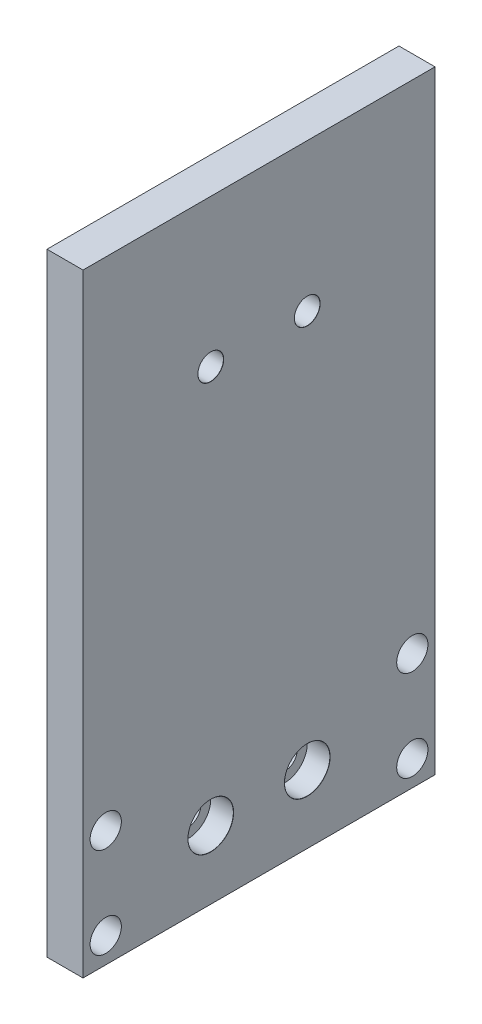
ISO-10303-21;
HEADER;
FILE_DESCRIPTION(('STEP AP214'),'2;1');
FILE_NAME('part.step','',(''),(''),'','','');
FILE_SCHEMA(('AUTOMOTIVE_DESIGN { 1 0 10303 214 1 1 1 1 }'));
ENDSEC;
DATA;
#1=APPLICATION_CONTEXT('core data for automotive mechanical design processes');
#2=APPLICATION_PROTOCOL_DEFINITION('international standard','automotive_design',2000,#1);
#3=PRODUCT_CONTEXT('',#1,'mechanical');
#4=PRODUCT('Part','Part','',(#3));
#5=PRODUCT_RELATED_PRODUCT_CATEGORY('part','',(#4));
#6=PRODUCT_DEFINITION_FORMATION('','',#4);
#7=PRODUCT_DEFINITION_CONTEXT('part definition',#1,'design');
#8=PRODUCT_DEFINITION('design','',#6,#7);
#9=PRODUCT_DEFINITION_SHAPE('','',#8);
#10=(LENGTH_UNIT() NAMED_UNIT(*) SI_UNIT(.MILLI.,.METRE.));
#11=(NAMED_UNIT(*) PLANE_ANGLE_UNIT() SI_UNIT($,.RADIAN.));
#12=(NAMED_UNIT(*) SI_UNIT($,.STERADIAN.) SOLID_ANGLE_UNIT());
#13=UNCERTAINTY_MEASURE_WITH_UNIT(LENGTH_MEASURE(1.E-05),#10,'distance_accuracy_value','');
#14=(GEOMETRIC_REPRESENTATION_CONTEXT(3) GLOBAL_UNCERTAINTY_ASSIGNED_CONTEXT((#13)) GLOBAL_UNIT_ASSIGNED_CONTEXT((#10,
#11,#12)) REPRESENTATION_CONTEXT('',''));
#15=CARTESIAN_POINT('',(0.,0.,0.));
#16=DIRECTION('',(0.,0.,1.));
#17=DIRECTION('',(1.,0.,0.));
#18=AXIS2_PLACEMENT_3D('',#15,#16,#17);
#19=CARTESIAN_POINT('',(6.35,0.,0.));
#20=DIRECTION('',(0.,0.,-1.));
#21=DIRECTION('',(-1.,0.,0.));
#22=AXIS2_PLACEMENT_3D('',#19,#20,#21);
#23=PLANE('',#22);
#24=DIRECTION('',(0.,-1.,0.));
#25=VECTOR('',#24,1.);
#26=CARTESIAN_POINT('',(0.,0.,0.));
#27=LINE('',#26,#25);
#28=CARTESIAN_POINT('',(0.,108.,0.));
#29=VERTEX_POINT('',#28);
#30=CARTESIAN_POINT('',(0.,0.,0.));
#31=VERTEX_POINT('',#30);
#32=EDGE_CURVE('E113',#29,#31,#27,.T.);
#33=ORIENTED_EDGE('',*,*,#32,.T.);
#34=DIRECTION('',(-1.,0.,0.));
#35=VECTOR('',#34,1.);
#36=CARTESIAN_POINT('',(6.35,0.,0.));
#37=LINE('',#36,#35);
#38=CARTESIAN_POINT('',(6.35,0.,0.));
#39=VERTEX_POINT('',#38);
#40=EDGE_CURVE('E11',#39,#31,#37,.T.);
#41=ORIENTED_EDGE('',*,*,#40,.F.);
#42=DIRECTION('',(0.,-1.,0.));
#43=VECTOR('',#42,1.);
#44=CARTESIAN_POINT('',(6.35,0.,0.));
#45=LINE('',#44,#43);
#46=CARTESIAN_POINT('',(6.35,108.,0.));
#47=VERTEX_POINT('',#46);
#48=EDGE_CURVE('E97',#47,#39,#45,.T.);
#49=ORIENTED_EDGE('',*,*,#48,.F.);
#50=DIRECTION('',(-1.,0.,0.));
#51=VECTOR('',#50,1.);
#52=CARTESIAN_POINT('',(6.35,108.,0.));
#53=LINE('',#52,#51);
#54=EDGE_CURVE('E109',#47,#29,#53,.T.);
#55=ORIENTED_EDGE('',*,*,#54,.T.);
#56=EDGE_LOOP('',(#33,#41,#49,#55));
#57=FACE_BOUND('',#56,.T.);
#58=ADVANCED_FACE('F45',(#57),#23,.F.);
#59=CARTESIAN_POINT('',(6.35,0.,0.));
#60=DIRECTION('',(0.,1.,0.));
#61=DIRECTION('',(0.,0.,1.));
#62=AXIS2_PLACEMENT_3D('',#59,#60,#61);
#63=PLANE('',#62);
#64=DIRECTION('',(0.,0.,-1.));
#65=VECTOR('',#64,1.);
#66=CARTESIAN_POINT('',(0.,0.,0.));
#67=LINE('',#66,#65);
#68=CARTESIAN_POINT('',(0.,0.,-62.));
#69=VERTEX_POINT('',#68);
#70=EDGE_CURVE('E102',#31,#69,#67,.T.);
#71=ORIENTED_EDGE('',*,*,#70,.T.);
#72=DIRECTION('',(-1.,0.,0.));
#73=VECTOR('',#72,1.);
#74=CARTESIAN_POINT('',(6.35,0.,-62.));
#75=LINE('',#74,#73);
#76=CARTESIAN_POINT('',(6.35,0.,-62.));
#77=VERTEX_POINT('',#76);
#78=EDGE_CURVE('E54',#77,#69,#75,.T.);
#79=ORIENTED_EDGE('',*,*,#78,.F.);
#80=DIRECTION('',(0.,0.,-1.));
#81=VECTOR('',#80,1.);
#82=CARTESIAN_POINT('',(6.35,0.,0.));
#83=LINE('',#82,#81);
#84=EDGE_CURVE('E92',#39,#77,#83,.T.);
#85=ORIENTED_EDGE('',*,*,#84,.F.);
#86=ORIENTED_EDGE('',*,*,#40,.T.);
#87=EDGE_LOOP('',(#71,#79,#85,#86));
#88=FACE_BOUND('',#87,.T.);
#89=ADVANCED_FACE('F101',(#88),#63,.F.);
#90=CARTESIAN_POINT('',(6.35,0.,-62.));
#91=DIRECTION('',(0.,0.,1.));
#92=DIRECTION('',(1.,0.,0.));
#93=AXIS2_PLACEMENT_3D('',#90,#91,#92);
#94=PLANE('',#93);
#95=DIRECTION('',(0.,1.,0.));
#96=VECTOR('',#95,1.);
#97=CARTESIAN_POINT('',(0.,0.,-62.));
#98=LINE('',#97,#96);
#99=CARTESIAN_POINT('',(0.,108.,-62.));
#100=VERTEX_POINT('',#99);
#101=EDGE_CURVE('E79',#69,#100,#98,.T.);
#102=ORIENTED_EDGE('',*,*,#101,.T.);
#103=DIRECTION('',(-1.,0.,0.));
#104=VECTOR('',#103,1.);
#105=CARTESIAN_POINT('',(6.35,108.,-62.));
#106=LINE('',#105,#104);
#107=CARTESIAN_POINT('',(6.35,108.,-62.));
#108=VERTEX_POINT('',#107);
#109=EDGE_CURVE('E104',#108,#100,#106,.T.);
#110=ORIENTED_EDGE('',*,*,#109,.F.);
#111=DIRECTION('',(0.,1.,0.));
#112=VECTOR('',#111,1.);
#113=CARTESIAN_POINT('',(6.35,0.,-62.));
#114=LINE('',#113,#112);
#115=EDGE_CURVE('E95',#77,#108,#114,.T.);
#116=ORIENTED_EDGE('',*,*,#115,.F.);
#117=ORIENTED_EDGE('',*,*,#78,.T.);
#118=EDGE_LOOP('',(#102,#110,#116,#117));
#119=FACE_BOUND('',#118,.T.);
#120=ADVANCED_FACE('F105',(#119),#94,.F.);
#121=CARTESIAN_POINT('',(6.35,108.,0.));
#122=DIRECTION('',(0.,-1.,0.));
#123=DIRECTION('',(0.,0.,-1.));
#124=AXIS2_PLACEMENT_3D('',#121,#122,#123);
#125=PLANE('',#124);
#126=DIRECTION('',(0.,0.,1.));
#127=VECTOR('',#126,1.);
#128=CARTESIAN_POINT('',(0.,108.,0.));
#129=LINE('',#128,#127);
#130=EDGE_CURVE('E85',#100,#29,#129,.T.);
#131=ORIENTED_EDGE('',*,*,#130,.T.);
#132=ORIENTED_EDGE('',*,*,#54,.F.);
#133=DIRECTION('',(0.,0.,1.));
#134=VECTOR('',#133,1.);
#135=CARTESIAN_POINT('',(6.35,108.,0.));
#136=LINE('',#135,#134);
#137=EDGE_CURVE('E62',#108,#47,#136,.T.);
#138=ORIENTED_EDGE('',*,*,#137,.F.);
#139=ORIENTED_EDGE('',*,*,#109,.T.);
#140=EDGE_LOOP('',(#131,#132,#138,#139));
#141=FACE_BOUND('',#140,.T.);
#142=ADVANCED_FACE('F127',(#141),#125,.F.);
#143=CARTESIAN_POINT('',(6.35,0.,0.));
#144=DIRECTION('',(-1.,0.,0.));
#145=DIRECTION('',(0.,0.,1.));
#146=AXIS2_PLACEMENT_3D('',#143,#144,#145);
#147=PLANE('',#146);
#148=CARTESIAN_POINT('',(6.35,12.,-22.5));
#149=DIRECTION('',(1.,0.,0.));
#150=DIRECTION('',(0.,0.,-1.));
#151=AXIS2_PLACEMENT_3D('',#148,#149,#150);
#152=CIRCLE('',#151,4.025);
#153=CARTESIAN_POINT('',(6.35,12.,-26.525));
#154=VERTEX_POINT('',#153);
#155=EDGE_CURVE('E241',#154,#154,#152,.T.);
#156=ORIENTED_EDGE('',*,*,#155,.F.);
#157=EDGE_LOOP('',(#156));
#158=FACE_BOUND('',#157,.T.);
#159=CARTESIAN_POINT('',(6.35,12.,-39.5));
#160=DIRECTION('',(1.,0.,0.));
#161=DIRECTION('',(0.,0.,-1.));
#162=AXIS2_PLACEMENT_3D('',#159,#160,#161);
#163=CIRCLE('',#162,4.025);
#164=CARTESIAN_POINT('',(6.35,12.,-43.525));
#165=VERTEX_POINT('',#164);
#166=EDGE_CURVE('E221',#165,#165,#163,.T.);
#167=ORIENTED_EDGE('',*,*,#166,.F.);
#168=EDGE_LOOP('',(#167));
#169=FACE_BOUND('',#168,.T.);
#170=CARTESIAN_POINT('',(6.35,82.,-39.5));
#171=DIRECTION('',(1.,0.,0.));
#172=DIRECTION('',(0.,0.,-1.));
#173=AXIS2_PLACEMENT_3D('',#170,#171,#172);
#174=CIRCLE('',#173,2.275);
#175=CARTESIAN_POINT('',(6.35,82.,-41.775));
#176=VERTEX_POINT('',#175);
#177=EDGE_CURVE('E201',#176,#176,#174,.T.);
#178=ORIENTED_EDGE('',*,*,#177,.F.);
#179=EDGE_LOOP('',(#178));
#180=FACE_BOUND('',#179,.T.);
#181=CARTESIAN_POINT('',(6.35,82.,-22.5));
#182=DIRECTION('',(1.,0.,0.));
#183=DIRECTION('',(0.,0.,-1.));
#184=AXIS2_PLACEMENT_3D('',#181,#182,#183);
#185=CIRCLE('',#184,2.275);
#186=CARTESIAN_POINT('',(6.35,82.,-24.775));
#187=VERTEX_POINT('',#186);
#188=EDGE_CURVE('E189',#187,#187,#185,.T.);
#189=ORIENTED_EDGE('',*,*,#188,.F.);
#190=EDGE_LOOP('',(#189));
#191=FACE_BOUND('',#190,.T.);
#192=CARTESIAN_POINT('',(6.35,20.5,-4.00000000000001));
#193=DIRECTION('',(-1.,0.,0.));
#194=DIRECTION('',(0.,0.,1.));
#195=AXIS2_PLACEMENT_3D('',#192,#193,#194);
#196=CIRCLE('',#195,2.75);
#197=CARTESIAN_POINT('',(6.35,20.5,-1.25000000000001));
#198=VERTEX_POINT('',#197);
#199=EDGE_CURVE('E169',#198,#198,#196,.T.);
#200=ORIENTED_EDGE('',*,*,#199,.T.);
#201=EDGE_LOOP('',(#200));
#202=FACE_BOUND('',#201,.T.);
#203=CARTESIAN_POINT('',(6.35,4.49999999999999,-4.));
#204=DIRECTION('',(-1.,0.,0.));
#205=DIRECTION('',(0.,0.,1.));
#206=AXIS2_PLACEMENT_3D('',#203,#204,#205);
#207=CIRCLE('',#206,2.75);
#208=CARTESIAN_POINT('',(6.35,4.49999999999999,-1.25));
#209=VERTEX_POINT('',#208);
#210=EDGE_CURVE('E157',#209,#209,#207,.T.);
#211=ORIENTED_EDGE('',*,*,#210,.T.);
#212=EDGE_LOOP('',(#211));
#213=FACE_BOUND('',#212,.T.);
#214=CARTESIAN_POINT('',(6.35,4.49999999999998,-58.));
#215=DIRECTION('',(-1.,0.,0.));
#216=DIRECTION('',(0.,0.,1.));
#217=AXIS2_PLACEMENT_3D('',#214,#215,#216);
#218=CIRCLE('',#217,2.75);
#219=CARTESIAN_POINT('',(6.35,4.49999999999998,-55.25));
#220=VERTEX_POINT('',#219);
#221=EDGE_CURVE('E145',#220,#220,#218,.T.);
#222=ORIENTED_EDGE('',*,*,#221,.T.);
#223=EDGE_LOOP('',(#222));
#224=FACE_BOUND('',#223,.T.);
#225=CARTESIAN_POINT('',(6.35,20.5,-58.));
#226=DIRECTION('',(-1.,0.,0.));
#227=DIRECTION('',(0.,0.,1.));
#228=AXIS2_PLACEMENT_3D('',#225,#226,#227);
#229=CIRCLE('',#228,2.75);
#230=CARTESIAN_POINT('',(6.35,20.5,-55.25));
#231=VERTEX_POINT('',#230);
#232=EDGE_CURVE('E117',#231,#231,#229,.T.);
#233=ORIENTED_EDGE('',*,*,#232,.T.);
#234=EDGE_LOOP('',(#233));
#235=FACE_BOUND('',#234,.T.);
#236=ORIENTED_EDGE('',*,*,#48,.T.);
#237=ORIENTED_EDGE('',*,*,#84,.T.);
#238=ORIENTED_EDGE('',*,*,#115,.T.);
#239=ORIENTED_EDGE('',*,*,#137,.T.);
#240=EDGE_LOOP('',(#236,#237,#238,#239));
#241=FACE_BOUND('',#240,.T.);
#242=ADVANCED_FACE('F93',(#158,#169,#180,#191,#202,#213,#224,#235,#241),#147,.F.);
#243=CARTESIAN_POINT('',(0.,0.,0.));
#244=DIRECTION('',(-1.,0.,0.));
#245=DIRECTION('',(0.,0.,1.));
#246=AXIS2_PLACEMENT_3D('',#243,#244,#245);
#247=PLANE('',#246);
#248=CARTESIAN_POINT('',(0.,12.,-22.5));
#249=DIRECTION('',(1.,0.,0.));
#250=DIRECTION('',(0.,0.,-1.));
#251=AXIS2_PLACEMENT_3D('',#248,#249,#250);
#252=CIRCLE('',#251,2.25);
#253=CARTESIAN_POINT('',(0.,12.,-24.75));
#254=VERTEX_POINT('',#253);
#255=EDGE_CURVE('E225',#254,#254,#252,.T.);
#256=ORIENTED_EDGE('',*,*,#255,.T.);
#257=EDGE_LOOP('',(#256));
#258=FACE_BOUND('',#257,.T.);
#259=CARTESIAN_POINT('',(0.,12.,-39.5));
#260=DIRECTION('',(1.,0.,0.));
#261=DIRECTION('',(0.,0.,-1.));
#262=AXIS2_PLACEMENT_3D('',#259,#260,#261);
#263=CIRCLE('',#262,2.25);
#264=CARTESIAN_POINT('',(0.,12.,-41.75));
#265=VERTEX_POINT('',#264);
#266=EDGE_CURVE('E205',#265,#265,#263,.T.);
#267=ORIENTED_EDGE('',*,*,#266,.T.);
#268=EDGE_LOOP('',(#267));
#269=FACE_BOUND('',#268,.T.);
#270=CARTESIAN_POINT('',(0.,82.,-39.5));
#271=DIRECTION('',(1.,0.,0.));
#272=DIRECTION('',(0.,0.,-1.));
#273=AXIS2_PLACEMENT_3D('',#270,#271,#272);
#274=CIRCLE('',#273,2.25);
#275=CARTESIAN_POINT('',(0.,82.,-41.75));
#276=VERTEX_POINT('',#275);
#277=EDGE_CURVE('E193',#276,#276,#274,.T.);
#278=ORIENTED_EDGE('',*,*,#277,.T.);
#279=EDGE_LOOP('',(#278));
#280=FACE_BOUND('',#279,.T.);
#281=CARTESIAN_POINT('',(0.,82.,-22.5));
#282=DIRECTION('',(1.,0.,0.));
#283=DIRECTION('',(0.,0.,-1.));
#284=AXIS2_PLACEMENT_3D('',#281,#282,#283);
#285=CIRCLE('',#284,2.25);
#286=CARTESIAN_POINT('',(0.,82.,-24.75));
#287=VERTEX_POINT('',#286);
#288=EDGE_CURVE('E181',#287,#287,#285,.T.);
#289=ORIENTED_EDGE('',*,*,#288,.T.);
#290=EDGE_LOOP('',(#289));
#291=FACE_BOUND('',#290,.T.);
#292=CARTESIAN_POINT('',(0.,20.5,-4.00000000000001));
#293=DIRECTION('',(-1.,0.,0.));
#294=DIRECTION('',(0.,0.,1.));
#295=AXIS2_PLACEMENT_3D('',#292,#293,#294);
#296=CIRCLE('',#295,2.775);
#297=CARTESIAN_POINT('',(0.,20.5,-1.22500000000001));
#298=VERTEX_POINT('',#297);
#299=EDGE_CURVE('E177',#298,#298,#296,.T.);
#300=ORIENTED_EDGE('',*,*,#299,.F.);
#301=EDGE_LOOP('',(#300));
#302=FACE_BOUND('',#301,.T.);
#303=CARTESIAN_POINT('',(0.,4.49999999999999,-4.));
#304=DIRECTION('',(-1.,0.,0.));
#305=DIRECTION('',(0.,0.,1.));
#306=AXIS2_PLACEMENT_3D('',#303,#304,#305);
#307=CIRCLE('',#306,2.775);
#308=CARTESIAN_POINT('',(0.,4.49999999999999,-1.225));
#309=VERTEX_POINT('',#308);
#310=EDGE_CURVE('E165',#309,#309,#307,.T.);
#311=ORIENTED_EDGE('',*,*,#310,.F.);
#312=EDGE_LOOP('',(#311));
#313=FACE_BOUND('',#312,.T.);
#314=CARTESIAN_POINT('',(0.,4.49999999999998,-58.));
#315=DIRECTION('',(-1.,0.,0.));
#316=DIRECTION('',(0.,0.,1.));
#317=AXIS2_PLACEMENT_3D('',#314,#315,#316);
#318=CIRCLE('',#317,2.775);
#319=CARTESIAN_POINT('',(0.,4.49999999999998,-55.225));
#320=VERTEX_POINT('',#319);
#321=EDGE_CURVE('E153',#320,#320,#318,.T.);
#322=ORIENTED_EDGE('',*,*,#321,.F.);
#323=EDGE_LOOP('',(#322));
#324=FACE_BOUND('',#323,.T.);
#325=CARTESIAN_POINT('',(0.,20.5,-58.));
#326=DIRECTION('',(-1.,0.,0.));
#327=DIRECTION('',(0.,0.,1.));
#328=AXIS2_PLACEMENT_3D('',#325,#326,#327);
#329=CIRCLE('',#328,2.775);
#330=CARTESIAN_POINT('',(0.,20.5,-55.225));
#331=VERTEX_POINT('',#330);
#332=EDGE_CURVE('E141',#331,#331,#329,.T.);
#333=ORIENTED_EDGE('',*,*,#332,.F.);
#334=EDGE_LOOP('',(#333));
#335=FACE_BOUND('',#334,.T.);
#336=ORIENTED_EDGE('',*,*,#32,.F.);
#337=ORIENTED_EDGE('',*,*,#130,.F.);
#338=ORIENTED_EDGE('',*,*,#101,.F.);
#339=ORIENTED_EDGE('',*,*,#70,.F.);
#340=EDGE_LOOP('',(#336,#337,#338,#339));
#341=FACE_BOUND('',#340,.T.);
#342=ADVANCED_FACE('F130',(#258,#269,#280,#291,#302,#313,#324,#335,#341),#247,.T.);
#343=CARTESIAN_POINT('',(0.,20.5,-58.));
#344=DIRECTION('',(-1.,0.,0.));
#345=DIRECTION('',(0.,0.,1.));
#346=AXIS2_PLACEMENT_3D('',#343,#344,#345);
#347=CYLINDRICAL_SURFACE('',#346,2.75);
#348=ORIENTED_EDGE('',*,*,#232,.F.);
#349=EDGE_LOOP('',(#348));
#350=FACE_BOUND('',#349,.T.);
#351=CARTESIAN_POINT('',(0.0209774907794329,20.5,-58.));
#352=DIRECTION('',(-1.,0.,0.));
#353=DIRECTION('',(0.,0.,1.));
#354=AXIS2_PLACEMENT_3D('',#351,#352,#353);
#355=CIRCLE('',#354,2.75);
#356=CARTESIAN_POINT('',(0.0209774907794329,20.5,-55.25));
#357=VERTEX_POINT('',#356);
#358=EDGE_CURVE('E137',#357,#357,#355,.T.);
#359=ORIENTED_EDGE('',*,*,#358,.T.);
#360=EDGE_LOOP('',(#359));
#361=FACE_BOUND('',#360,.T.);
#362=ADVANCED_FACE('F265',(#350,#361),#347,.F.);
#363=CARTESIAN_POINT('',(0.,20.5,-58.));
#364=DIRECTION('',(-1.,0.,0.));
#365=DIRECTION('',(0.,0.,1.));
#366=AXIS2_PLACEMENT_3D('',#363,#364,#365);
#367=CONICAL_SURFACE('',#366,2.775,0.872664625997118);
#368=ORIENTED_EDGE('',*,*,#358,.F.);
#369=EDGE_LOOP('',(#368));
#370=FACE_BOUND('',#369,.T.);
#371=ORIENTED_EDGE('',*,*,#332,.T.);
#372=EDGE_LOOP('',(#371));
#373=FACE_BOUND('',#372,.T.);
#374=ADVANCED_FACE('F268',(#370,#373),#367,.F.);
#375=CARTESIAN_POINT('',(0.,4.49999999999998,-58.));
#376=DIRECTION('',(-1.,0.,0.));
#377=DIRECTION('',(0.,0.,1.));
#378=AXIS2_PLACEMENT_3D('',#375,#376,#377);
#379=CYLINDRICAL_SURFACE('',#378,2.75);
#380=ORIENTED_EDGE('',*,*,#221,.F.);
#381=EDGE_LOOP('',(#380));
#382=FACE_BOUND('',#381,.T.);
#383=CARTESIAN_POINT('',(0.0209774907794329,4.49999999999998,-58.));
#384=DIRECTION('',(-1.,0.,0.));
#385=DIRECTION('',(0.,0.,1.));
#386=AXIS2_PLACEMENT_3D('',#383,#384,#385);
#387=CIRCLE('',#386,2.75);
#388=CARTESIAN_POINT('',(0.0209774907794329,4.49999999999998,-55.25));
#389=VERTEX_POINT('',#388);
#390=EDGE_CURVE('E149',#389,#389,#387,.T.);
#391=ORIENTED_EDGE('',*,*,#390,.T.);
#392=EDGE_LOOP('',(#391));
#393=FACE_BOUND('',#392,.T.);
#394=ADVANCED_FACE('F274',(#382,#393),#379,.F.);
#395=CARTESIAN_POINT('',(0.,4.49999999999998,-58.));
#396=DIRECTION('',(-1.,0.,0.));
#397=DIRECTION('',(0.,0.,1.));
#398=AXIS2_PLACEMENT_3D('',#395,#396,#397);
#399=CONICAL_SURFACE('',#398,2.775,0.872664625997135);
#400=ORIENTED_EDGE('',*,*,#390,.F.);
#401=EDGE_LOOP('',(#400));
#402=FACE_BOUND('',#401,.T.);
#403=ORIENTED_EDGE('',*,*,#321,.T.);
#404=EDGE_LOOP('',(#403));
#405=FACE_BOUND('',#404,.T.);
#406=ADVANCED_FACE('F486',(#402,#405),#399,.F.);
#407=CARTESIAN_POINT('',(0.,4.49999999999999,-4.));
#408=DIRECTION('',(-1.,0.,0.));
#409=DIRECTION('',(0.,0.,1.));
#410=AXIS2_PLACEMENT_3D('',#407,#408,#409);
#411=CYLINDRICAL_SURFACE('',#410,2.75);
#412=ORIENTED_EDGE('',*,*,#210,.F.);
#413=EDGE_LOOP('',(#412));
#414=FACE_BOUND('',#413,.T.);
#415=CARTESIAN_POINT('',(0.0209774907794329,4.49999999999999,-4.));
#416=DIRECTION('',(-1.,0.,0.));
#417=DIRECTION('',(0.,0.,1.));
#418=AXIS2_PLACEMENT_3D('',#415,#416,#417);
#419=CIRCLE('',#418,2.75);
#420=CARTESIAN_POINT('',(0.0209774907794329,4.49999999999999,-1.25));
#421=VERTEX_POINT('',#420);
#422=EDGE_CURVE('E161',#421,#421,#419,.T.);
#423=ORIENTED_EDGE('',*,*,#422,.T.);
#424=EDGE_LOOP('',(#423));
#425=FACE_BOUND('',#424,.T.);
#426=ADVANCED_FACE('F476',(#414,#425),#411,.F.);
#427=CARTESIAN_POINT('',(0.,4.49999999999999,-4.));
#428=DIRECTION('',(-1.,0.,0.));
#429=DIRECTION('',(0.,0.,1.));
#430=AXIS2_PLACEMENT_3D('',#427,#428,#429);
#431=CONICAL_SURFACE('',#430,2.775,0.872664625997135);
#432=ORIENTED_EDGE('',*,*,#422,.F.);
#433=EDGE_LOOP('',(#432));
#434=FACE_BOUND('',#433,.T.);
#435=ORIENTED_EDGE('',*,*,#310,.T.);
#436=EDGE_LOOP('',(#435));
#437=FACE_BOUND('',#436,.T.);
#438=ADVANCED_FACE('F466',(#434,#437),#431,.F.);
#439=CARTESIAN_POINT('',(0.,20.5,-4.00000000000001));
#440=DIRECTION('',(-1.,0.,0.));
#441=DIRECTION('',(0.,0.,1.));
#442=AXIS2_PLACEMENT_3D('',#439,#440,#441);
#443=CYLINDRICAL_SURFACE('',#442,2.75);
#444=ORIENTED_EDGE('',*,*,#199,.F.);
#445=EDGE_LOOP('',(#444));
#446=FACE_BOUND('',#445,.T.);
#447=CARTESIAN_POINT('',(0.0209774907794329,20.5,-4.00000000000001));
#448=DIRECTION('',(-1.,0.,0.));
#449=DIRECTION('',(0.,0.,1.));
#450=AXIS2_PLACEMENT_3D('',#447,#448,#449);
#451=CIRCLE('',#450,2.75);
#452=CARTESIAN_POINT('',(0.0209774907794329,20.5,-1.25000000000001));
#453=VERTEX_POINT('',#452);
#454=EDGE_CURVE('E173',#453,#453,#451,.T.);
#455=ORIENTED_EDGE('',*,*,#454,.T.);
#456=EDGE_LOOP('',(#455));
#457=FACE_BOUND('',#456,.T.);
#458=ADVANCED_FACE('F456',(#446,#457),#443,.F.);
#459=CARTESIAN_POINT('',(0.,20.5,-4.00000000000001));
#460=DIRECTION('',(-1.,0.,0.));
#461=DIRECTION('',(0.,0.,1.));
#462=AXIS2_PLACEMENT_3D('',#459,#460,#461);
#463=CONICAL_SURFACE('',#462,2.775,0.872664625997118);
#464=ORIENTED_EDGE('',*,*,#454,.F.);
#465=EDGE_LOOP('',(#464));
#466=FACE_BOUND('',#465,.T.);
#467=ORIENTED_EDGE('',*,*,#299,.T.);
#468=EDGE_LOOP('',(#467));
#469=FACE_BOUND('',#468,.T.);
#470=ADVANCED_FACE('F446',(#466,#469),#463,.F.);
#471=CARTESIAN_POINT('',(6.35,82.,-22.5));
#472=DIRECTION('',(1.,0.,0.));
#473=DIRECTION('',(0.,0.,-1.));
#474=AXIS2_PLACEMENT_3D('',#471,#472,#473);
#475=CYLINDRICAL_SURFACE('',#474,2.25);
#476=ORIENTED_EDGE('',*,*,#288,.F.);
#477=EDGE_LOOP('',(#476));
#478=FACE_BOUND('',#477,.T.);
#479=CARTESIAN_POINT('',(6.32902250922057,82.,-22.5));
#480=DIRECTION('',(1.,0.,0.));
#481=DIRECTION('',(0.,0.,-1.));
#482=AXIS2_PLACEMENT_3D('',#479,#480,#481);
#483=CIRCLE('',#482,2.25);
#484=CARTESIAN_POINT('',(6.32902250922057,82.,-24.75));
#485=VERTEX_POINT('',#484);
#486=EDGE_CURVE('E185',#485,#485,#483,.T.);
#487=ORIENTED_EDGE('',*,*,#486,.T.);
#488=EDGE_LOOP('',(#487));
#489=FACE_BOUND('',#488,.T.);
#490=ADVANCED_FACE('F436',(#478,#489),#475,.F.);
#491=CARTESIAN_POINT('',(6.35,82.,-22.5));
#492=DIRECTION('',(1.,0.,0.));
#493=DIRECTION('',(0.,0.,-1.));
#494=AXIS2_PLACEMENT_3D('',#491,#492,#493);
#495=CONICAL_SURFACE('',#494,2.275,0.872664625997131);
#496=ORIENTED_EDGE('',*,*,#486,.F.);
#497=EDGE_LOOP('',(#496));
#498=FACE_BOUND('',#497,.T.);
#499=ORIENTED_EDGE('',*,*,#188,.T.);
#500=EDGE_LOOP('',(#499));
#501=FACE_BOUND('',#500,.T.);
#502=ADVANCED_FACE('F427',(#498,#501),#495,.F.);
#503=CARTESIAN_POINT('',(6.35,82.,-39.5));
#504=DIRECTION('',(1.,0.,0.));
#505=DIRECTION('',(0.,0.,-1.));
#506=AXIS2_PLACEMENT_3D('',#503,#504,#505);
#507=CYLINDRICAL_SURFACE('',#506,2.25);
#508=ORIENTED_EDGE('',*,*,#277,.F.);
#509=EDGE_LOOP('',(#508));
#510=FACE_BOUND('',#509,.T.);
#511=CARTESIAN_POINT('',(6.32902250922057,82.,-39.5));
#512=DIRECTION('',(1.,0.,0.));
#513=DIRECTION('',(0.,0.,-1.));
#514=AXIS2_PLACEMENT_3D('',#511,#512,#513);
#515=CIRCLE('',#514,2.25);
#516=CARTESIAN_POINT('',(6.32902250922057,82.,-41.75));
#517=VERTEX_POINT('',#516);
#518=EDGE_CURVE('E197',#517,#517,#515,.T.);
#519=ORIENTED_EDGE('',*,*,#518,.T.);
#520=EDGE_LOOP('',(#519));
#521=FACE_BOUND('',#520,.T.);
#522=ADVANCED_FACE('F418',(#510,#521),#507,.F.);
#523=CARTESIAN_POINT('',(6.35,82.,-39.5));
#524=DIRECTION('',(1.,0.,0.));
#525=DIRECTION('',(0.,0.,-1.));
#526=AXIS2_PLACEMENT_3D('',#523,#524,#525);
#527=CONICAL_SURFACE('',#526,2.275,0.872664625997131);
#528=ORIENTED_EDGE('',*,*,#518,.F.);
#529=EDGE_LOOP('',(#528));
#530=FACE_BOUND('',#529,.T.);
#531=ORIENTED_EDGE('',*,*,#177,.T.);
#532=EDGE_LOOP('',(#531));
#533=FACE_BOUND('',#532,.T.);
#534=ADVANCED_FACE('F310',(#530,#533),#527,.F.);
#535=CARTESIAN_POINT('',(6.35,12.,-39.5));
#536=DIRECTION('',(1.,0.,0.));
#537=DIRECTION('',(0.,0.,-1.));
#538=AXIS2_PLACEMENT_3D('',#535,#536,#537);
#539=CYLINDRICAL_SURFACE('',#538,2.25);
#540=ORIENTED_EDGE('',*,*,#266,.F.);
#541=EDGE_LOOP('',(#540));
#542=FACE_BOUND('',#541,.T.);
#543=CARTESIAN_POINT('',(2.35,12.,-39.5));
#544=DIRECTION('',(1.,0.,0.));
#545=DIRECTION('',(0.,0.,-1.));
#546=AXIS2_PLACEMENT_3D('',#543,#544,#545);
#547=CIRCLE('',#546,2.25);
#548=CARTESIAN_POINT('',(2.35,12.,-41.75));
#549=VERTEX_POINT('',#548);
#550=EDGE_CURVE('E209',#549,#549,#547,.T.);
#551=ORIENTED_EDGE('',*,*,#550,.T.);
#552=EDGE_LOOP('',(#551));
#553=FACE_BOUND('',#552,.T.);
#554=ADVANCED_FACE('F321',(#542,#553),#539,.F.);
#555=CARTESIAN_POINT('',(2.35,16.,-39.5));
#556=DIRECTION('',(-1.,0.,0.));
#557=DIRECTION('',(0.,0.,1.));
#558=AXIS2_PLACEMENT_3D('',#555,#556,#557);
#559=PLANE('',#558);
#560=ORIENTED_EDGE('',*,*,#550,.F.);
#561=EDGE_LOOP('',(#560));
#562=FACE_BOUND('',#561,.T.);
#563=CARTESIAN_POINT('',(2.35,12.,-39.5));
#564=DIRECTION('',(1.,0.,0.));
#565=DIRECTION('',(0.,0.,-1.));
#566=AXIS2_PLACEMENT_3D('',#563,#564,#565);
#567=CIRCLE('',#566,4.);
#568=CARTESIAN_POINT('',(2.35,12.,-43.5));
#569=VERTEX_POINT('',#568);
#570=EDGE_CURVE('E213',#569,#569,#567,.T.);
#571=ORIENTED_EDGE('',*,*,#570,.T.);
#572=EDGE_LOOP('',(#571));
#573=FACE_BOUND('',#572,.T.);
#574=ADVANCED_FACE('F326',(#562,#573),#559,.F.);
#575=CARTESIAN_POINT('',(6.35,12.,-39.5));
#576=DIRECTION('',(1.,0.,0.));
#577=DIRECTION('',(0.,0.,-1.));
#578=AXIS2_PLACEMENT_3D('',#575,#576,#577);
#579=CYLINDRICAL_SURFACE('',#578,4.);
#580=ORIENTED_EDGE('',*,*,#570,.F.);
#581=EDGE_LOOP('',(#580));
#582=FACE_BOUND('',#581,.T.);
#583=CARTESIAN_POINT('',(6.32902250922057,12.,-39.5));
#584=DIRECTION('',(1.,0.,0.));
#585=DIRECTION('',(0.,0.,-1.));
#586=AXIS2_PLACEMENT_3D('',#583,#584,#585);
#587=CIRCLE('',#586,4.);
#588=CARTESIAN_POINT('',(6.32902250922057,12.,-43.5));
#589=VERTEX_POINT('',#588);
#590=EDGE_CURVE('E217',#589,#589,#587,.T.);
#591=ORIENTED_EDGE('',*,*,#590,.T.);
#592=EDGE_LOOP('',(#591));
#593=FACE_BOUND('',#592,.T.);
#594=ADVANCED_FACE('F337',(#582,#593),#579,.F.);
#595=CARTESIAN_POINT('',(6.35,12.,-39.5));
#596=DIRECTION('',(1.,0.,0.));
#597=DIRECTION('',(0.,0.,-1.));
#598=AXIS2_PLACEMENT_3D('',#595,#596,#597);
#599=CONICAL_SURFACE('',#598,4.025,0.872664625997227);
#600=ORIENTED_EDGE('',*,*,#590,.F.);
#601=EDGE_LOOP('',(#600));
#602=FACE_BOUND('',#601,.T.);
#603=ORIENTED_EDGE('',*,*,#166,.T.);
#604=EDGE_LOOP('',(#603));
#605=FACE_BOUND('',#604,.T.);
#606=ADVANCED_FACE('F348',(#602,#605),#599,.F.);
#607=CARTESIAN_POINT('',(6.35,12.,-22.5));
#608=DIRECTION('',(1.,0.,0.));
#609=DIRECTION('',(0.,0.,-1.));
#610=AXIS2_PLACEMENT_3D('',#607,#608,#609);
#611=CYLINDRICAL_SURFACE('',#610,2.25);
#612=ORIENTED_EDGE('',*,*,#255,.F.);
#613=EDGE_LOOP('',(#612));
#614=FACE_BOUND('',#613,.T.);
#615=CARTESIAN_POINT('',(2.35,12.,-22.5));
#616=DIRECTION('',(1.,0.,0.));
#617=DIRECTION('',(0.,0.,-1.));
#618=AXIS2_PLACEMENT_3D('',#615,#616,#617);
#619=CIRCLE('',#618,2.25);
#620=CARTESIAN_POINT('',(2.35,12.,-24.75));
#621=VERTEX_POINT('',#620);
#622=EDGE_CURVE('E229',#621,#621,#619,.T.);
#623=ORIENTED_EDGE('',*,*,#622,.T.);
#624=EDGE_LOOP('',(#623));
#625=FACE_BOUND('',#624,.T.);
#626=ADVANCED_FACE('F359',(#614,#625),#611,.F.);
#627=CARTESIAN_POINT('',(2.35,16.,-22.5));
#628=DIRECTION('',(-1.,0.,0.));
#629=DIRECTION('',(0.,0.,1.));
#630=AXIS2_PLACEMENT_3D('',#627,#628,#629);
#631=PLANE('',#630);
#632=ORIENTED_EDGE('',*,*,#622,.F.);
#633=EDGE_LOOP('',(#632));
#634=FACE_BOUND('',#633,.T.);
#635=CARTESIAN_POINT('',(2.35,12.,-22.5));
#636=DIRECTION('',(1.,0.,0.));
#637=DIRECTION('',(0.,0.,-1.));
#638=AXIS2_PLACEMENT_3D('',#635,#636,#637);
#639=CIRCLE('',#638,4.);
#640=CARTESIAN_POINT('',(2.35,12.,-26.5));
#641=VERTEX_POINT('',#640);
#642=EDGE_CURVE('E233',#641,#641,#639,.T.);
#643=ORIENTED_EDGE('',*,*,#642,.T.);
#644=EDGE_LOOP('',(#643));
#645=FACE_BOUND('',#644,.T.);
#646=ADVANCED_FACE('F370',(#634,#645),#631,.F.);
#647=CARTESIAN_POINT('',(6.35,12.,-22.5));
#648=DIRECTION('',(1.,0.,0.));
#649=DIRECTION('',(0.,0.,-1.));
#650=AXIS2_PLACEMENT_3D('',#647,#648,#649);
#651=CYLINDRICAL_SURFACE('',#650,4.);
#652=ORIENTED_EDGE('',*,*,#642,.F.);
#653=EDGE_LOOP('',(#652));
#654=FACE_BOUND('',#653,.T.);
#655=CARTESIAN_POINT('',(6.32902250922057,12.,-22.5));
#656=DIRECTION('',(1.,0.,0.));
#657=DIRECTION('',(0.,0.,-1.));
#658=AXIS2_PLACEMENT_3D('',#655,#656,#657);
#659=CIRCLE('',#658,4.);
#660=CARTESIAN_POINT('',(6.32902250922057,12.,-26.5));
#661=VERTEX_POINT('',#660);
#662=EDGE_CURVE('E237',#661,#661,#659,.T.);
#663=ORIENTED_EDGE('',*,*,#662,.T.);
#664=EDGE_LOOP('',(#663));
#665=FACE_BOUND('',#664,.T.);
#666=ADVANCED_FACE('F381',(#654,#665),#651,.F.);
#667=CARTESIAN_POINT('',(6.35,12.,-22.5));
#668=DIRECTION('',(1.,0.,0.));
#669=DIRECTION('',(0.,0.,-1.));
#670=AXIS2_PLACEMENT_3D('',#667,#668,#669);
#671=CONICAL_SURFACE('',#670,4.025,0.872664625997159);
#672=ORIENTED_EDGE('',*,*,#662,.F.);
#673=EDGE_LOOP('',(#672));
#674=FACE_BOUND('',#673,.T.);
#675=ORIENTED_EDGE('',*,*,#155,.T.);
#676=EDGE_LOOP('',(#675));
#677=FACE_BOUND('',#676,.T.);
#678=ADVANCED_FACE('F246',(#674,#677),#671,.F.);
#679=CLOSED_SHELL('',(#58,#89,#120,#142,#242,#342,#362,#374,#394,#406,#426,#438,#458,#470,#490,
#502,#522,#534,#554,#574,#594,#606,#626,#646,#666,#678));
#680=MANIFOLD_SOLID_BREP('B2',#679);
#681=ADVANCED_BREP_SHAPE_REPRESENTATION('',(#18,#680),#14);
#682=SHAPE_DEFINITION_REPRESENTATION(#9,#681);
ENDSEC;
END-ISO-10303-21;
